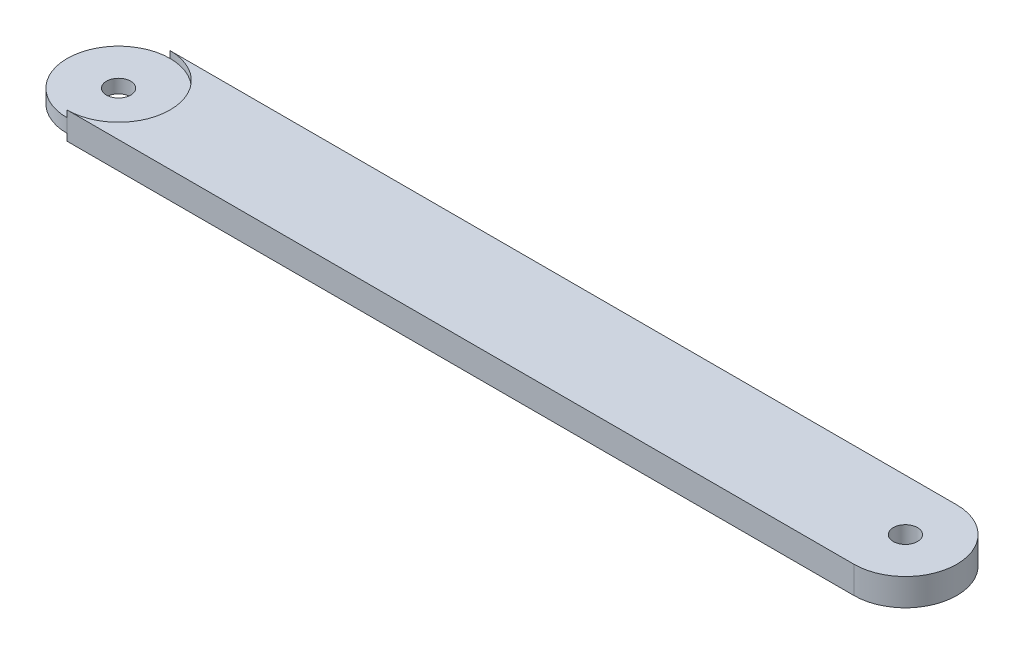
ISO-10303-21;
HEADER;
FILE_DESCRIPTION(('STEP AP214'),'2;1');
FILE_NAME('part.step','',(''),(''),'','','');
FILE_SCHEMA(('AUTOMOTIVE_DESIGN { 1 0 10303 214 1 1 1 1 }'));
ENDSEC;
DATA;
#1=APPLICATION_CONTEXT('core data for automotive mechanical design processes');
#2=APPLICATION_PROTOCOL_DEFINITION('international standard','automotive_design',2000,#1);
#3=PRODUCT_CONTEXT('',#1,'mechanical');
#4=PRODUCT('Part','Part','',(#3));
#5=PRODUCT_RELATED_PRODUCT_CATEGORY('part','',(#4));
#6=PRODUCT_DEFINITION_FORMATION('','',#4);
#7=PRODUCT_DEFINITION_CONTEXT('part definition',#1,'design');
#8=PRODUCT_DEFINITION('design','',#6,#7);
#9=PRODUCT_DEFINITION_SHAPE('','',#8);
#10=(LENGTH_UNIT() NAMED_UNIT(*) SI_UNIT(.MILLI.,.METRE.));
#11=(NAMED_UNIT(*) PLANE_ANGLE_UNIT() SI_UNIT($,.RADIAN.));
#12=(NAMED_UNIT(*) SI_UNIT($,.STERADIAN.) SOLID_ANGLE_UNIT());
#13=UNCERTAINTY_MEASURE_WITH_UNIT(LENGTH_MEASURE(1.E-05),#10,'distance_accuracy_value','');
#14=(GEOMETRIC_REPRESENTATION_CONTEXT(3) GLOBAL_UNCERTAINTY_ASSIGNED_CONTEXT((#13)) GLOBAL_UNIT_ASSIGNED_CONTEXT((#10,
#11,#12)) REPRESENTATION_CONTEXT('',''));
#15=CARTESIAN_POINT('',(0.,0.,0.));
#16=DIRECTION('',(0.,0.,1.));
#17=DIRECTION('',(1.,0.,0.));
#18=AXIS2_PLACEMENT_3D('',#15,#16,#17);
#19=CARTESIAN_POINT('',(-232.15,8.,0.));
#20=DIRECTION('',(0.,-1.,0.));
#21=DIRECTION('',(0.,0.,-1.));
#22=AXIS2_PLACEMENT_3D('',#19,#20,#21);
#23=CYLINDRICAL_SURFACE('',#22,30.35);
#24=CARTESIAN_POINT('',(-232.15,-4.,0.));
#25=DIRECTION('',(0.,1.,0.));
#26=DIRECTION('',(0.,0.,1.));
#27=AXIS2_PLACEMENT_3D('',#24,#25,#26);
#28=CIRCLE('',#27,30.35);
#29=CARTESIAN_POINT('',(-232.15,-4.,-30.35));
#30=VERTEX_POINT('',#29);
#31=CARTESIAN_POINT('',(-232.15,-4.,30.35));
#32=VERTEX_POINT('',#31);
#33=EDGE_CURVE('E114',#30,#32,#28,.T.);
#34=ORIENTED_EDGE('',*,*,#33,.T.);
#35=DIRECTION('',(0.,-1.,0.));
#36=VECTOR('',#35,1.);
#37=CARTESIAN_POINT('',(-232.15,8.,30.35));
#38=LINE('',#37,#36);
#39=CARTESIAN_POINT('',(-232.15,4.,30.35));
#40=VERTEX_POINT('',#39);
#41=EDGE_CURVE('E48',#40,#32,#38,.T.);
#42=ORIENTED_EDGE('',*,*,#41,.F.);
#43=CARTESIAN_POINT('',(-232.15,4.,0.));
#44=DIRECTION('',(0.,1.,0.));
#45=DIRECTION('',(0.,0.,1.));
#46=AXIS2_PLACEMENT_3D('',#43,#44,#45);
#47=CIRCLE('',#46,30.35);
#48=CARTESIAN_POINT('',(-232.15,4.,-30.35));
#49=VERTEX_POINT('',#48);
#50=EDGE_CURVE('E165',#49,#40,#47,.T.);
#51=ORIENTED_EDGE('',*,*,#50,.F.);
#52=DIRECTION('',(0.,-1.,0.));
#53=VECTOR('',#52,1.);
#54=CARTESIAN_POINT('',(-232.15,8.,-30.35));
#55=LINE('',#54,#53);
#56=EDGE_CURVE('E122',#49,#30,#55,.T.);
#57=ORIENTED_EDGE('',*,*,#56,.T.);
#58=EDGE_LOOP('',(#34,#42,#51,#57));
#59=FACE_BOUND('',#58,.T.);
#60=ADVANCED_FACE('F38',(#59),#23,.T.);
#61=CARTESIAN_POINT('',(-232.15,8.,30.35));
#62=DIRECTION('',(0.,0.,-1.));
#63=DIRECTION('',(-1.,0.,0.));
#64=AXIS2_PLACEMENT_3D('',#61,#62,#63);
#65=PLANE('',#64);
#66=DIRECTION('',(1.,0.,0.));
#67=VECTOR('',#66,1.);
#68=CARTESIAN_POINT('',(-232.15,-8.,30.35));
#69=LINE('',#68,#67);
#70=CARTESIAN_POINT('',(-232.15,-8.,30.35));
#71=VERTEX_POINT('',#70);
#72=CARTESIAN_POINT('',(232.15,-8.,30.35));
#73=VERTEX_POINT('',#72);
#74=EDGE_CURVE('E144',#71,#73,#69,.T.);
#75=ORIENTED_EDGE('',*,*,#74,.T.);
#76=DIRECTION('',(0.,-1.,0.));
#77=VECTOR('',#76,1.);
#78=CARTESIAN_POINT('',(232.15,8.,30.35));
#79=LINE('',#78,#77);
#80=CARTESIAN_POINT('',(232.15,8.,30.35));
#81=VERTEX_POINT('',#80);
#82=EDGE_CURVE('E127',#81,#73,#79,.T.);
#83=ORIENTED_EDGE('',*,*,#82,.F.);
#84=DIRECTION('',(1.,0.,0.));
#85=VECTOR('',#84,1.);
#86=CARTESIAN_POINT('',(-232.15,8.,30.35));
#87=LINE('',#86,#85);
#88=CARTESIAN_POINT('',(-232.15,8.,30.35));
#89=VERTEX_POINT('',#88);
#90=EDGE_CURVE('E141',#89,#81,#87,.T.);
#91=ORIENTED_EDGE('',*,*,#90,.F.);
#92=EDGE_CURVE('E11',#89,#40,#38,.T.);
#93=ORIENTED_EDGE('',*,*,#92,.T.);
#94=ORIENTED_EDGE('',*,*,#41,.T.);
#95=DIRECTION('',(0.,-1.,0.));
#96=VECTOR('',#95,1.);
#97=CARTESIAN_POINT('',(-232.15,-4.,30.35));
#98=LINE('',#97,#96);
#99=EDGE_CURVE('E100',#71,#32,#98,.F.);
#100=ORIENTED_EDGE('',*,*,#99,.F.);
#101=EDGE_LOOP('',(#75,#83,#91,#93,#94,#100));
#102=FACE_BOUND('',#101,.T.);
#103=ADVANCED_FACE('F124',(#102),#65,.F.);
#104=CARTESIAN_POINT('',(232.15,8.,0.));
#105=DIRECTION('',(0.,-1.,0.));
#106=DIRECTION('',(0.,0.,-1.));
#107=AXIS2_PLACEMENT_3D('',#104,#105,#106);
#108=CYLINDRICAL_SURFACE('',#107,30.35);
#109=CARTESIAN_POINT('',(232.15,-8.,0.));
#110=DIRECTION('',(0.,1.,0.));
#111=DIRECTION('',(0.,0.,1.));
#112=AXIS2_PLACEMENT_3D('',#109,#110,#111);
#113=CIRCLE('',#112,30.35);
#114=CARTESIAN_POINT('',(232.15,-8.,-30.35));
#115=VERTEX_POINT('',#114);
#116=EDGE_CURVE('E70',#73,#115,#113,.T.);
#117=ORIENTED_EDGE('',*,*,#116,.T.);
#118=DIRECTION('',(0.,-1.,0.));
#119=VECTOR('',#118,1.);
#120=CARTESIAN_POINT('',(232.15,8.,-30.35));
#121=LINE('',#120,#119);
#122=CARTESIAN_POINT('',(232.15,8.,-30.35));
#123=VERTEX_POINT('',#122);
#124=EDGE_CURVE('E129',#123,#115,#121,.T.);
#125=ORIENTED_EDGE('',*,*,#124,.F.);
#126=CARTESIAN_POINT('',(232.15,8.,0.));
#127=DIRECTION('',(0.,1.,0.));
#128=DIRECTION('',(0.,0.,1.));
#129=AXIS2_PLACEMENT_3D('',#126,#127,#128);
#130=CIRCLE('',#129,30.35);
#131=EDGE_CURVE('E56',#81,#123,#130,.T.);
#132=ORIENTED_EDGE('',*,*,#131,.F.);
#133=ORIENTED_EDGE('',*,*,#82,.T.);
#134=EDGE_LOOP('',(#117,#125,#132,#133));
#135=FACE_BOUND('',#134,.T.);
#136=ADVANCED_FACE('F200',(#135),#108,.T.);
#137=CARTESIAN_POINT('',(-232.15,8.,-30.35));
#138=DIRECTION('',(0.,0.,1.));
#139=DIRECTION('',(1.,0.,0.));
#140=AXIS2_PLACEMENT_3D('',#137,#138,#139);
#141=PLANE('',#140);
#142=DIRECTION('',(-1.,0.,0.));
#143=VECTOR('',#142,1.);
#144=CARTESIAN_POINT('',(-232.15,-8.,-30.35));
#145=LINE('',#144,#143);
#146=CARTESIAN_POINT('',(-232.15,-8.,-30.35));
#147=VERTEX_POINT('',#146);
#148=EDGE_CURVE('E137',#115,#147,#145,.T.);
#149=ORIENTED_EDGE('',*,*,#148,.T.);
#150=DIRECTION('',(0.,-1.,0.));
#151=VECTOR('',#150,1.);
#152=CARTESIAN_POINT('',(-232.15,-4.,-30.35));
#153=LINE('',#152,#151);
#154=EDGE_CURVE('E77',#147,#30,#153,.F.);
#155=ORIENTED_EDGE('',*,*,#154,.T.);
#156=ORIENTED_EDGE('',*,*,#56,.F.);
#157=CARTESIAN_POINT('',(-232.15,8.,-30.35));
#158=VERTEX_POINT('',#157);
#159=EDGE_CURVE('E134',#158,#49,#55,.T.);
#160=ORIENTED_EDGE('',*,*,#159,.F.);
#161=DIRECTION('',(-1.,0.,0.));
#162=VECTOR('',#161,1.);
#163=CARTESIAN_POINT('',(-232.15,8.,-30.35));
#164=LINE('',#163,#162);
#165=EDGE_CURVE('E148',#123,#158,#164,.T.);
#166=ORIENTED_EDGE('',*,*,#165,.F.);
#167=ORIENTED_EDGE('',*,*,#124,.T.);
#168=EDGE_LOOP('',(#149,#155,#156,#160,#166,#167));
#169=FACE_BOUND('',#168,.T.);
#170=ADVANCED_FACE('F205',(#169),#141,.F.);
#171=CARTESIAN_POINT('',(-232.15,8.,0.));
#172=DIRECTION('',(0.,1.,0.));
#173=DIRECTION('',(0.,0.,1.));
#174=AXIS2_PLACEMENT_3D('',#171,#172,#173);
#175=PLANE('',#174);
#176=CARTESIAN_POINT('',(-232.15,8.,0.));
#177=DIRECTION('',(0.,1.,0.));
#178=DIRECTION('',(0.,0.,1.));
#179=AXIS2_PLACEMENT_3D('',#176,#177,#178);
#180=CIRCLE('',#179,30.35);
#181=EDGE_CURVE('E109',#89,#158,#180,.T.);
#182=ORIENTED_EDGE('',*,*,#181,.F.);
#183=ORIENTED_EDGE('',*,*,#90,.T.);
#184=ORIENTED_EDGE('',*,*,#131,.T.);
#185=ORIENTED_EDGE('',*,*,#165,.T.);
#186=EDGE_LOOP('',(#182,#183,#184,#185));
#187=FACE_BOUND('',#186,.T.);
#188=CARTESIAN_POINT('',(232.15,8.,0.));
#189=DIRECTION('',(0.,1.,0.));
#190=DIRECTION('',(0.,0.,1.));
#191=AXIS2_PLACEMENT_3D('',#188,#189,#190);
#192=CIRCLE('',#191,7.14999999999998);
#193=CARTESIAN_POINT('',(232.15,8.,7.14999999999998));
#194=VERTEX_POINT('',#193);
#195=EDGE_CURVE('E155',#194,#194,#192,.T.);
#196=ORIENTED_EDGE('',*,*,#195,.F.);
#197=EDGE_LOOP('',(#196));
#198=FACE_BOUND('',#197,.T.);
#199=ADVANCED_FACE('F209',(#187,#198),#175,.T.);
#200=CARTESIAN_POINT('',(-232.15,-8.,0.));
#201=DIRECTION('',(0.,1.,0.));
#202=DIRECTION('',(0.,0.,1.));
#203=AXIS2_PLACEMENT_3D('',#200,#201,#202);
#204=PLANE('',#203);
#205=CARTESIAN_POINT('',(-232.15,-8.,0.));
#206=DIRECTION('',(0.,1.,0.));
#207=DIRECTION('',(0.,0.,1.));
#208=AXIS2_PLACEMENT_3D('',#205,#206,#207);
#209=CIRCLE('',#208,30.35);
#210=EDGE_CURVE('E104',#71,#147,#209,.T.);
#211=ORIENTED_EDGE('',*,*,#210,.T.);
#212=ORIENTED_EDGE('',*,*,#148,.F.);
#213=ORIENTED_EDGE('',*,*,#116,.F.);
#214=ORIENTED_EDGE('',*,*,#74,.F.);
#215=EDGE_LOOP('',(#211,#212,#213,#214));
#216=FACE_BOUND('',#215,.T.);
#217=CARTESIAN_POINT('',(232.15,-8.,0.));
#218=DIRECTION('',(0.,1.,0.));
#219=DIRECTION('',(0.,0.,1.));
#220=AXIS2_PLACEMENT_3D('',#217,#218,#219);
#221=CIRCLE('',#220,7.14999999999998);
#222=CARTESIAN_POINT('',(232.15,-8.,7.14999999999998));
#223=VERTEX_POINT('',#222);
#224=EDGE_CURVE('E147',#223,#223,#221,.T.);
#225=ORIENTED_EDGE('',*,*,#224,.T.);
#226=EDGE_LOOP('',(#225));
#227=FACE_BOUND('',#226,.T.);
#228=ADVANCED_FACE('F211',(#216,#227),#204,.F.);
#229=CARTESIAN_POINT('',(232.15,-8.,0.));
#230=DIRECTION('',(0.,1.,0.));
#231=DIRECTION('',(0.,0.,1.));
#232=AXIS2_PLACEMENT_3D('',#229,#230,#231);
#233=CYLINDRICAL_SURFACE('',#232,7.14999999999998);
#234=ORIENTED_EDGE('',*,*,#224,.F.);
#235=EDGE_LOOP('',(#234));
#236=FACE_BOUND('',#235,.T.);
#237=ORIENTED_EDGE('',*,*,#195,.T.);
#238=EDGE_LOOP('',(#237));
#239=FACE_BOUND('',#238,.T.);
#240=ADVANCED_FACE('F214',(#236,#239),#233,.F.);
#241=CARTESIAN_POINT('',(-232.15,4.,0.));
#242=DIRECTION('',(0.,1.,0.));
#243=DIRECTION('',(0.,0.,1.));
#244=AXIS2_PLACEMENT_3D('',#241,#242,#243);
#245=CYLINDRICAL_SURFACE('',#244,30.35);
#246=ORIENTED_EDGE('',*,*,#92,.F.);
#247=ORIENTED_EDGE('',*,*,#181,.T.);
#248=ORIENTED_EDGE('',*,*,#159,.T.);
#249=EDGE_CURVE('E159',#40,#49,#47,.T.);
#250=ORIENTED_EDGE('',*,*,#249,.F.);
#251=EDGE_LOOP('',(#246,#247,#248,#250));
#252=FACE_BOUND('',#251,.T.);
#253=ADVANCED_FACE('F220',(#252),#245,.F.);
#254=CARTESIAN_POINT('',(-232.15,4.,0.));
#255=DIRECTION('',(0.,1.,0.));
#256=DIRECTION('',(0.,0.,1.));
#257=AXIS2_PLACEMENT_3D('',#254,#255,#256);
#258=PLANE('',#257);
#259=CARTESIAN_POINT('',(-232.15,4.,0.));
#260=DIRECTION('',(0.,1.,0.));
#261=DIRECTION('',(0.,0.,1.));
#262=AXIS2_PLACEMENT_3D('',#259,#260,#261);
#263=CIRCLE('',#262,7.14999999999998);
#264=CARTESIAN_POINT('',(-232.15,4.,7.14999999999998));
#265=VERTEX_POINT('',#264);
#266=EDGE_CURVE('E173',#265,#265,#263,.T.);
#267=ORIENTED_EDGE('',*,*,#266,.F.);
#268=EDGE_LOOP('',(#267));
#269=FACE_BOUND('',#268,.T.);
#270=ORIENTED_EDGE('',*,*,#249,.T.);
#271=ORIENTED_EDGE('',*,*,#50,.T.);
#272=EDGE_LOOP('',(#270,#271));
#273=FACE_BOUND('',#272,.T.);
#274=ADVANCED_FACE('F193',(#269,#273),#258,.T.);
#275=CARTESIAN_POINT('',(-232.15,-4.,0.));
#276=DIRECTION('',(0.,-1.,0.));
#277=DIRECTION('',(0.,0.,-1.));
#278=AXIS2_PLACEMENT_3D('',#275,#276,#277);
#279=CYLINDRICAL_SURFACE('',#278,30.35);
#280=ORIENTED_EDGE('',*,*,#99,.T.);
#281=EDGE_CURVE('E103',#32,#30,#28,.T.);
#282=ORIENTED_EDGE('',*,*,#281,.T.);
#283=ORIENTED_EDGE('',*,*,#154,.F.);
#284=ORIENTED_EDGE('',*,*,#210,.F.);
#285=EDGE_LOOP('',(#280,#282,#283,#284));
#286=FACE_BOUND('',#285,.T.);
#287=ADVANCED_FACE('F102',(#286),#279,.F.);
#288=CARTESIAN_POINT('',(-232.15,-4.,0.));
#289=DIRECTION('',(0.,-1.,0.));
#290=DIRECTION('',(0.,0.,1.));
#291=AXIS2_PLACEMENT_3D('',#288,#289,#290);
#292=PLANE('',#291);
#293=CARTESIAN_POINT('',(-232.15,-4.,0.));
#294=DIRECTION('',(0.,-1.,0.));
#295=DIRECTION('',(0.,0.,-1.));
#296=AXIS2_PLACEMENT_3D('',#293,#294,#295);
#297=CIRCLE('',#296,7.14999999999998);
#298=CARTESIAN_POINT('',(-232.15,-4.,-7.14999999999998));
#299=VERTEX_POINT('',#298);
#300=EDGE_CURVE('E41',#299,#299,#297,.T.);
#301=ORIENTED_EDGE('',*,*,#300,.F.);
#302=EDGE_LOOP('',(#301));
#303=FACE_BOUND('',#302,.T.);
#304=ORIENTED_EDGE('',*,*,#281,.F.);
#305=ORIENTED_EDGE('',*,*,#33,.F.);
#306=EDGE_LOOP('',(#304,#305));
#307=FACE_BOUND('',#306,.T.);
#308=ADVANCED_FACE('F113',(#303,#307),#292,.T.);
#309=CARTESIAN_POINT('',(-232.15,-8.,0.));
#310=DIRECTION('',(0.,1.,0.));
#311=DIRECTION('',(0.,0.,1.));
#312=AXIS2_PLACEMENT_3D('',#309,#310,#311);
#313=CYLINDRICAL_SURFACE('',#312,7.14999999999998);
#314=ORIENTED_EDGE('',*,*,#300,.T.);
#315=EDGE_LOOP('',(#314));
#316=FACE_BOUND('',#315,.T.);
#317=ORIENTED_EDGE('',*,*,#266,.T.);
#318=EDGE_LOOP('',(#317));
#319=FACE_BOUND('',#318,.T.);
#320=ADVANCED_FACE('F182',(#316,#319),#313,.F.);
#321=CLOSED_SHELL('',(#60,#103,#136,#170,#199,#228,#240,#253,#274,#287,#308,#320));
#322=MANIFOLD_SOLID_BREP('B2',#321);
#323=ADVANCED_BREP_SHAPE_REPRESENTATION('',(#18,#322),#14);
#324=SHAPE_DEFINITION_REPRESENTATION(#9,#323);
ENDSEC;
END-ISO-10303-21;
